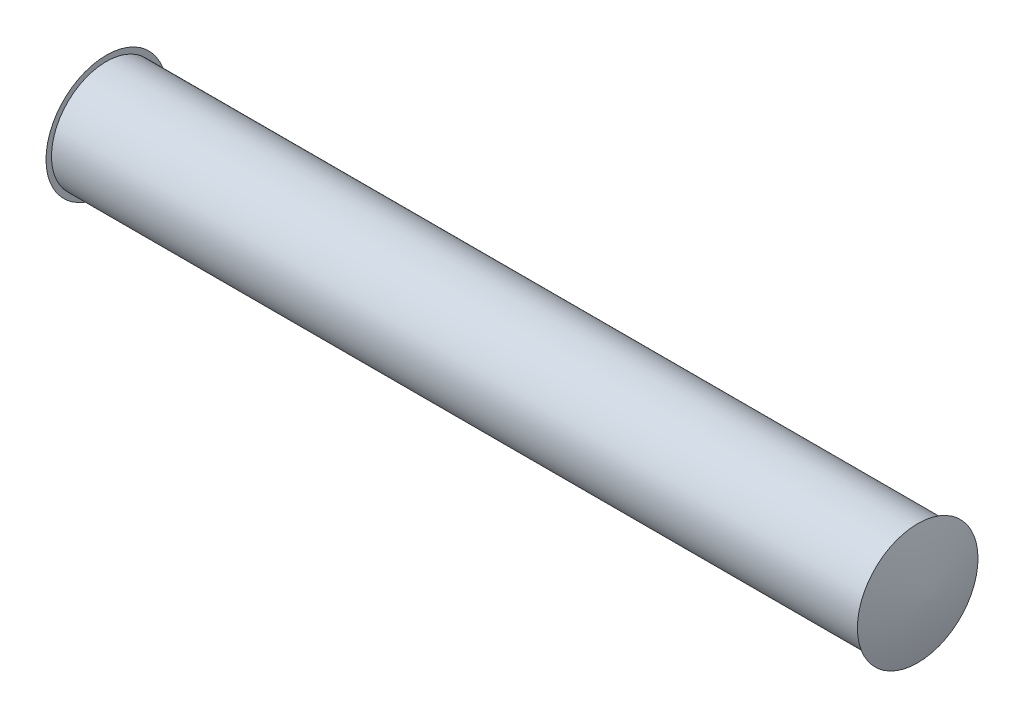
ISO-10303-21;
HEADER;
FILE_DESCRIPTION(('STEP AP214'),'2;1');
FILE_NAME('part.step','',(''),(''),'','','');
FILE_SCHEMA(('AUTOMOTIVE_DESIGN { 1 0 10303 214 1 1 1 1 }'));
ENDSEC;
DATA;
#1=APPLICATION_CONTEXT('core data for automotive mechanical design processes');
#2=APPLICATION_PROTOCOL_DEFINITION('international standard','automotive_design',2000,#1);
#3=PRODUCT_CONTEXT('',#1,'mechanical');
#4=PRODUCT('Part','Part','',(#3));
#5=PRODUCT_RELATED_PRODUCT_CATEGORY('part','',(#4));
#6=PRODUCT_DEFINITION_FORMATION('','',#4);
#7=PRODUCT_DEFINITION_CONTEXT('part definition',#1,'design');
#8=PRODUCT_DEFINITION('design','',#6,#7);
#9=PRODUCT_DEFINITION_SHAPE('','',#8);
#10=(LENGTH_UNIT() NAMED_UNIT(*) SI_UNIT(.MILLI.,.METRE.));
#11=(NAMED_UNIT(*) PLANE_ANGLE_UNIT() SI_UNIT($,.RADIAN.));
#12=(NAMED_UNIT(*) SI_UNIT($,.STERADIAN.) SOLID_ANGLE_UNIT());
#13=UNCERTAINTY_MEASURE_WITH_UNIT(LENGTH_MEASURE(1.E-05),#10,'distance_accuracy_value','');
#14=(GEOMETRIC_REPRESENTATION_CONTEXT(3) GLOBAL_UNCERTAINTY_ASSIGNED_CONTEXT((#13)) GLOBAL_UNIT_ASSIGNED_CONTEXT((#10,
#11,#12)) REPRESENTATION_CONTEXT('',''));
#15=CARTESIAN_POINT('',(0.,0.,0.));
#16=DIRECTION('',(0.,0.,1.));
#17=DIRECTION('',(1.,0.,0.));
#18=AXIS2_PLACEMENT_3D('',#15,#16,#17);
#19=CARTESIAN_POINT('',(-9.398,0.,0.));
#20=DIRECTION('',(1.,0.,0.));
#21=DIRECTION('',(0.,0.,-1.));
#22=AXIS2_PLACEMENT_3D('',#19,#20,#21);
#23=CYLINDRICAL_SURFACE('',#22,1.27);
#24=CARTESIAN_POINT('',(-9.398,0.,0.));
#25=DIRECTION('',(1.,0.,0.));
#26=DIRECTION('',(0.,0.,-1.));
#27=AXIS2_PLACEMENT_3D('',#24,#25,#26);
#28=CIRCLE('',#27,1.27);
#29=CARTESIAN_POINT('',(-9.398,0.,-1.27));
#30=VERTEX_POINT('',#29);
#31=EDGE_CURVE('E36',#30,#30,#28,.T.);
#32=ORIENTED_EDGE('',*,*,#31,.T.);
#33=EDGE_LOOP('',(#32));
#34=FACE_BOUND('',#33,.T.);
#35=CARTESIAN_POINT('',(9.398,0.,0.));
#36=DIRECTION('',(1.,0.,0.));
#37=DIRECTION('',(0.,0.,-1.));
#38=AXIS2_PLACEMENT_3D('',#35,#36,#37);
#39=CIRCLE('',#38,1.27);
#40=CARTESIAN_POINT('',(9.398,0.,-1.27));
#41=VERTEX_POINT('',#40);
#42=EDGE_CURVE('E11',#41,#41,#39,.T.);
#43=ORIENTED_EDGE('',*,*,#42,.F.);
#44=EDGE_LOOP('',(#43));
#45=FACE_BOUND('',#44,.T.);
#46=ADVANCED_FACE('F33',(#34,#45),#23,.T.);
#47=CARTESIAN_POINT('',(9.652,0.,0.));
#48=CARTESIAN_POINT('',(9.61305660895698,0.,-0.714655058640561));
#49=CARTESIAN_POINT('',(9.398,0.,-1.397));
#50=B_SPLINE_CURVE_WITH_KNOTS('',2,(#47,#48,#49),.UNSPECIFIED.,.F.,.F.,(3,3),(0.,1.),.UNSPECIFIED.);
#51=CARTESIAN_POINT('',(9.398,0.,0.));
#52=DIRECTION('',(-1.,0.,0.));
#53=AXIS1_PLACEMENT('',#51,#52);
#54=SURFACE_OF_REVOLUTION('',#50,#53);
#55=CARTESIAN_POINT('',(9.398,0.,0.));
#56=DIRECTION('',(-1.,0.,0.));
#57=DIRECTION('',(0.,0.,1.));
#58=AXIS2_PLACEMENT_3D('',#55,#56,#57);
#59=CIRCLE('',#58,1.397);
#60=CARTESIAN_POINT('',(9.398,0.,1.397));
#61=VERTEX_POINT('',#60);
#62=EDGE_CURVE('E41',#61,#61,#59,.T.);
#63=ORIENTED_EDGE('',*,*,#62,.F.);
#64=EDGE_LOOP('',(#63));
#65=FACE_BOUND('',#64,.T.);
#66=CARTESIAN_POINT('',(9.652,0.,0.));
#67=VERTEX_POINT('',#66);
#68=VERTEX_LOOP('',#67);
#69=FACE_BOUND('',#68,.T.);
#70=ADVANCED_FACE('F59',(#65,#69),#54,.T.);
#71=CARTESIAN_POINT('',(9.398,0.,0.));
#72=DIRECTION('',(1.,0.,0.));
#73=DIRECTION('',(0.,0.,-1.));
#74=AXIS2_PLACEMENT_3D('',#71,#72,#73);
#75=PLANE('',#74);
#76=ORIENTED_EDGE('',*,*,#42,.T.);
#77=EDGE_LOOP('',(#76));
#78=FACE_BOUND('',#77,.T.);
#79=ORIENTED_EDGE('',*,*,#62,.T.);
#80=EDGE_LOOP('',(#79));
#81=FACE_BOUND('',#80,.T.);
#82=ADVANCED_FACE('F50',(#78,#81),#75,.F.);
#83=CARTESIAN_POINT('',(-9.652,0.,0.));
#84=CARTESIAN_POINT('',(-9.61305660895698,0.,-0.714655058640561));
#85=CARTESIAN_POINT('',(-9.398,0.,-1.397));
#86=B_SPLINE_CURVE_WITH_KNOTS('',2,(#83,#84,#85),.UNSPECIFIED.,.F.,.F.,(3,3),(0.,1.),.UNSPECIFIED.);
#87=CARTESIAN_POINT('',(-9.398,0.,0.));
#88=DIRECTION('',(1.,0.,0.));
#89=AXIS1_PLACEMENT('',#87,#88);
#90=SURFACE_OF_REVOLUTION('',#86,#89);
#91=CARTESIAN_POINT('',(-9.398,0.,0.));
#92=DIRECTION('',(-1.,0.,0.));
#93=DIRECTION('',(0.,0.,1.));
#94=AXIS2_PLACEMENT_3D('',#91,#92,#93);
#95=CIRCLE('',#94,1.397);
#96=CARTESIAN_POINT('',(-9.398,0.,1.397));
#97=VERTEX_POINT('',#96);
#98=EDGE_CURVE('E78',#97,#97,#95,.T.);
#99=ORIENTED_EDGE('',*,*,#98,.T.);
#100=EDGE_LOOP('',(#99));
#101=FACE_BOUND('',#100,.T.);
#102=CARTESIAN_POINT('',(-9.652,0.,0.));
#103=VERTEX_POINT('',#102);
#104=VERTEX_LOOP('',#103);
#105=FACE_BOUND('',#104,.T.);
#106=ADVANCED_FACE('F47',(#101,#105),#90,.T.);
#107=CARTESIAN_POINT('',(-9.398,0.,0.));
#108=DIRECTION('',(-1.,0.,0.));
#109=DIRECTION('',(0.,0.,-1.));
#110=AXIS2_PLACEMENT_3D('',#107,#108,#109);
#111=PLANE('',#110);
#112=ORIENTED_EDGE('',*,*,#31,.F.);
#113=EDGE_LOOP('',(#112));
#114=FACE_BOUND('',#113,.T.);
#115=ORIENTED_EDGE('',*,*,#98,.F.);
#116=EDGE_LOOP('',(#115));
#117=FACE_BOUND('',#116,.T.);
#118=ADVANCED_FACE('F49',(#114,#117),#111,.F.);
#119=CLOSED_SHELL('',(#46,#70,#82,#106,#118));
#120=MANIFOLD_SOLID_BREP('B2',#119);
#121=ADVANCED_BREP_SHAPE_REPRESENTATION('',(#18,#120),#14);
#122=SHAPE_DEFINITION_REPRESENTATION(#9,#121);
ENDSEC;
END-ISO-10303-21;
